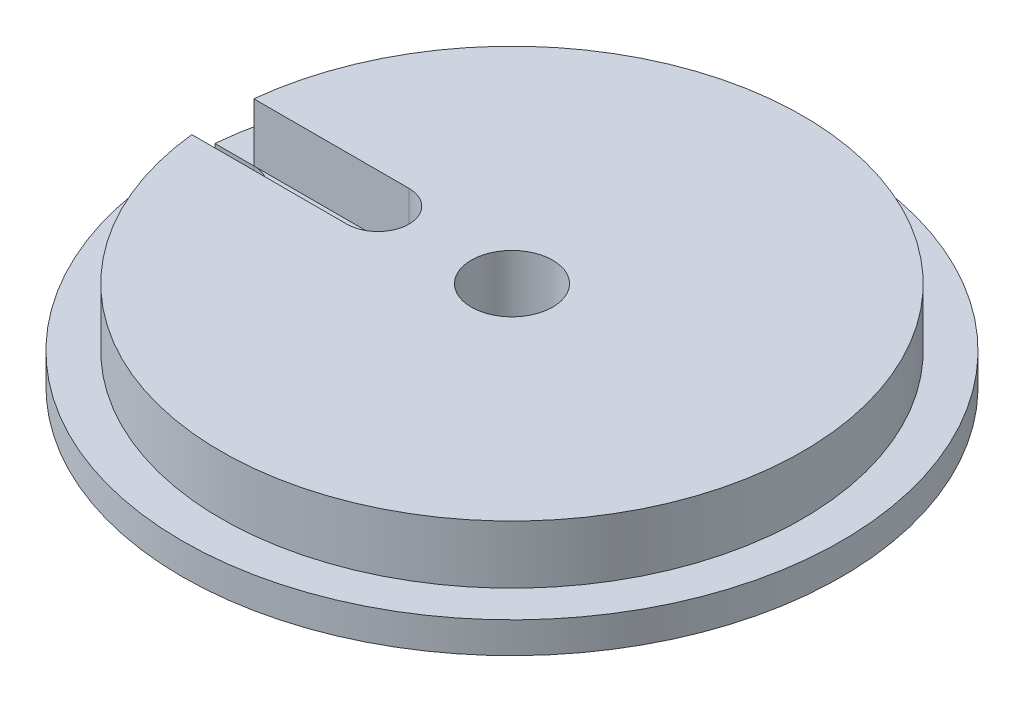
ISO-10303-21;
HEADER;
FILE_DESCRIPTION(('STEP AP214'),'2;1');
FILE_NAME('part.step','',(''),(''),'','','');
FILE_SCHEMA(('AUTOMOTIVE_DESIGN { 1 0 10303 214 1 1 1 1 }'));
ENDSEC;
DATA;
#1=APPLICATION_CONTEXT('core data for automotive mechanical design processes');
#2=APPLICATION_PROTOCOL_DEFINITION('international standard','automotive_design',2000,#1);
#3=PRODUCT_CONTEXT('',#1,'mechanical');
#4=PRODUCT('Part','Part','',(#3));
#5=PRODUCT_RELATED_PRODUCT_CATEGORY('part','',(#4));
#6=PRODUCT_DEFINITION_FORMATION('','',#4);
#7=PRODUCT_DEFINITION_CONTEXT('part definition',#1,'design');
#8=PRODUCT_DEFINITION('design','',#6,#7);
#9=PRODUCT_DEFINITION_SHAPE('','',#8);
#10=(LENGTH_UNIT() NAMED_UNIT(*) SI_UNIT(.MILLI.,.METRE.));
#11=(NAMED_UNIT(*) PLANE_ANGLE_UNIT() SI_UNIT($,.RADIAN.));
#12=(NAMED_UNIT(*) SI_UNIT($,.STERADIAN.) SOLID_ANGLE_UNIT());
#13=UNCERTAINTY_MEASURE_WITH_UNIT(LENGTH_MEASURE(1.E-05),#10,'distance_accuracy_value','');
#14=(GEOMETRIC_REPRESENTATION_CONTEXT(3) GLOBAL_UNCERTAINTY_ASSIGNED_CONTEXT((#13)) GLOBAL_UNIT_ASSIGNED_CONTEXT((#10,
#11,#12)) REPRESENTATION_CONTEXT('',''));
#15=CARTESIAN_POINT('',(0.,0.,0.));
#16=DIRECTION('',(0.,0.,1.));
#17=DIRECTION('',(1.,0.,0.));
#18=AXIS2_PLACEMENT_3D('',#15,#16,#17);
#19=CARTESIAN_POINT('',(0.,3.,0.));
#20=DIRECTION('',(0.,1.,0.));
#21=DIRECTION('',(0.,0.,1.));
#22=AXIS2_PLACEMENT_3D('',#19,#20,#21);
#23=PLANE('',#22);
#24=DIRECTION('',(-1.,0.,0.));
#25=VECTOR('',#24,1.);
#26=CARTESIAN_POINT('',(-14.9144225500017,3.,-1.6));
#27=LINE('',#26,#25);
#28=CARTESIAN_POINT('',(-6.91442255000173,3.,-1.6));
#29=VERTEX_POINT('',#28);
#30=CARTESIAN_POINT('',(-14.9144225500017,3.,-1.6));
#31=VERTEX_POINT('',#30);
#32=EDGE_CURVE('E130',#29,#31,#27,.T.);
#33=ORIENTED_EDGE('',*,*,#32,.F.);
#34=CARTESIAN_POINT('',(-6.91442255000173,3.,0.));
#35=DIRECTION('',(0.,1.,0.));
#36=DIRECTION('',(0.,0.,-1.));
#37=AXIS2_PLACEMENT_3D('',#34,#35,#36);
#38=CIRCLE('',#37,1.6);
#39=CARTESIAN_POINT('',(-6.91442255000173,3.,1.6));
#40=VERTEX_POINT('',#39);
#41=EDGE_CURVE('E122',#40,#29,#38,.T.);
#42=ORIENTED_EDGE('',*,*,#41,.F.);
#43=DIRECTION('',(1.,0.,0.));
#44=VECTOR('',#43,1.);
#45=CARTESIAN_POINT('',(-14.9144225500017,3.,1.6));
#46=LINE('',#45,#44);
#47=CARTESIAN_POINT('',(-14.9144225500017,3.,1.6));
#48=VERTEX_POINT('',#47);
#49=EDGE_CURVE('E119',#48,#40,#46,.T.);
#50=ORIENTED_EDGE('',*,*,#49,.F.);
#51=CARTESIAN_POINT('',(0.,3.,0.));
#52=DIRECTION('',(0.,1.,0.));
#53=DIRECTION('',(0.,0.,1.));
#54=AXIS2_PLACEMENT_3D('',#51,#52,#53);
#55=CIRCLE('',#54,15.);
#56=EDGE_CURVE('E144',#48,#31,#55,.T.);
#57=ORIENTED_EDGE('',*,*,#56,.T.);
#58=EDGE_LOOP('',(#33,#42,#50,#57));
#59=FACE_BOUND('',#58,.T.);
#60=CARTESIAN_POINT('',(0.,3.,0.));
#61=DIRECTION('',(0.,1.,0.));
#62=DIRECTION('',(0.,0.,1.));
#63=AXIS2_PLACEMENT_3D('',#60,#61,#62);
#64=CIRCLE('',#63,2.1);
#65=CARTESIAN_POINT('',(0.,3.,2.1));
#66=VERTEX_POINT('',#65);
#67=EDGE_CURVE('E140',#66,#66,#64,.T.);
#68=ORIENTED_EDGE('',*,*,#67,.F.);
#69=EDGE_LOOP('',(#68));
#70=FACE_BOUND('',#69,.T.);
#71=ADVANCED_FACE('F35',(#59,#70),#23,.T.);
#72=CARTESIAN_POINT('',(0.,3.,0.));
#73=DIRECTION('',(0.,-1.,0.));
#74=DIRECTION('',(0.,0.,-1.));
#75=AXIS2_PLACEMENT_3D('',#72,#73,#74);
#76=CYLINDRICAL_SURFACE('',#75,15.);
#77=CARTESIAN_POINT('',(0.,0.,0.));
#78=DIRECTION('',(0.,1.,0.));
#79=DIRECTION('',(0.,0.,1.));
#80=AXIS2_PLACEMENT_3D('',#77,#78,#79);
#81=CIRCLE('',#80,15.);
#82=CARTESIAN_POINT('',(-14.9144225500017,0.,1.6));
#83=VERTEX_POINT('',#82);
#84=CARTESIAN_POINT('',(-14.9144225500017,0.,-1.6));
#85=VERTEX_POINT('',#84);
#86=EDGE_CURVE('E143',#83,#85,#81,.T.);
#87=ORIENTED_EDGE('',*,*,#86,.T.);
#88=DIRECTION('',(0.,-1.,0.));
#89=VECTOR('',#88,1.);
#90=CARTESIAN_POINT('',(-14.9144225500017,3.,-1.6));
#91=LINE('',#90,#89);
#92=EDGE_CURVE('E11',#85,#31,#91,.F.);
#93=ORIENTED_EDGE('',*,*,#92,.T.);
#94=ORIENTED_EDGE('',*,*,#56,.F.);
#95=DIRECTION('',(0.,-1.,0.));
#96=VECTOR('',#95,1.);
#97=CARTESIAN_POINT('',(-14.9144225500017,3.,1.6));
#98=LINE('',#97,#96);
#99=EDGE_CURVE('E43',#48,#83,#98,.T.);
#100=ORIENTED_EDGE('',*,*,#99,.T.);
#101=EDGE_LOOP('',(#87,#93,#94,#100));
#102=FACE_BOUND('',#101,.T.);
#103=ADVANCED_FACE('F37',(#102),#76,.T.);
#104=CARTESIAN_POINT('',(0.,3.,0.));
#105=DIRECTION('',(0.,-1.,0.));
#106=DIRECTION('',(0.,0.,-1.));
#107=AXIS2_PLACEMENT_3D('',#104,#105,#106);
#108=CYLINDRICAL_SURFACE('',#107,2.1);
#109=ORIENTED_EDGE('',*,*,#67,.T.);
#110=EDGE_LOOP('',(#109));
#111=FACE_BOUND('',#110,.T.);
#112=CARTESIAN_POINT('',(0.,-1.6,0.));
#113=DIRECTION('',(0.,-1.,0.));
#114=DIRECTION('',(0.,0.,-1.));
#115=AXIS2_PLACEMENT_3D('',#112,#113,#114);
#116=CIRCLE('',#115,2.1);
#117=CARTESIAN_POINT('',(0.,-1.6,-2.1));
#118=VERTEX_POINT('',#117);
#119=EDGE_CURVE('E182',#118,#118,#116,.T.);
#120=ORIENTED_EDGE('',*,*,#119,.T.);
#121=EDGE_LOOP('',(#120));
#122=FACE_BOUND('',#121,.T.);
#123=ADVANCED_FACE('F188',(#111,#122),#108,.F.);
#124=CARTESIAN_POINT('',(-6.91442255000173,-7.,0.));
#125=DIRECTION('',(0.,1.,0.));
#126=DIRECTION('',(0.,0.,1.));
#127=AXIS2_PLACEMENT_3D('',#124,#125,#126);
#128=CYLINDRICAL_SURFACE('',#127,1.6);
#129=DIRECTION('',(0.,1.,0.));
#130=VECTOR('',#129,1.);
#131=CARTESIAN_POINT('',(-6.91442255000173,-7.,1.6));
#132=LINE('',#131,#130);
#133=CARTESIAN_POINT('',(-6.91442255000173,0.,1.6));
#134=VERTEX_POINT('',#133);
#135=EDGE_CURVE('E132',#134,#40,#132,.T.);
#136=ORIENTED_EDGE('',*,*,#135,.T.);
#137=ORIENTED_EDGE('',*,*,#41,.T.);
#138=DIRECTION('',(0.,1.,0.));
#139=VECTOR('',#138,1.);
#140=CARTESIAN_POINT('',(-6.91442255000173,-7.,-1.6));
#141=LINE('',#140,#139);
#142=CARTESIAN_POINT('',(-6.91442255000173,0.,-1.6));
#143=VERTEX_POINT('',#142);
#144=EDGE_CURVE('E133',#143,#29,#141,.T.);
#145=ORIENTED_EDGE('',*,*,#144,.F.);
#146=CARTESIAN_POINT('',(-6.91442255000173,0.,0.));
#147=DIRECTION('',(0.,-1.,0.));
#148=DIRECTION('',(0.,0.,-1.));
#149=AXIS2_PLACEMENT_3D('',#146,#147,#148);
#150=CIRCLE('',#149,1.6);
#151=EDGE_CURVE('E178',#134,#143,#150,.T.);
#152=ORIENTED_EDGE('',*,*,#151,.F.);
#153=EDGE_LOOP('',(#136,#137,#145,#152));
#154=FACE_BOUND('',#153,.T.);
#155=CARTESIAN_POINT('',(-6.91442255000173,-1.6,0.));
#156=DIRECTION('',(0.,-1.,0.));
#157=DIRECTION('',(0.,0.,-1.));
#158=AXIS2_PLACEMENT_3D('',#155,#156,#157);
#159=CIRCLE('',#158,1.6);
#160=CARTESIAN_POINT('',(-6.91442255000173,-1.6,-1.6));
#161=VERTEX_POINT('',#160);
#162=EDGE_CURVE('E176',#161,#161,#159,.T.);
#163=ORIENTED_EDGE('',*,*,#162,.T.);
#164=EDGE_LOOP('',(#163));
#165=FACE_BOUND('',#164,.T.);
#166=ADVANCED_FACE('F209',(#154,#165),#128,.F.);
#167=CARTESIAN_POINT('',(-14.9144225500017,-7.,-1.6));
#168=DIRECTION('',(0.,0.,-1.));
#169=DIRECTION('',(-1.,0.,0.));
#170=AXIS2_PLACEMENT_3D('',#167,#168,#169);
#171=PLANE('',#170);
#172=ORIENTED_EDGE('',*,*,#144,.T.);
#173=ORIENTED_EDGE('',*,*,#32,.T.);
#174=ORIENTED_EDGE('',*,*,#92,.F.);
#175=DIRECTION('',(-1.,0.,0.));
#176=VECTOR('',#175,1.);
#177=CARTESIAN_POINT('',(0.,0.,-1.6));
#178=LINE('',#177,#176);
#179=EDGE_CURVE('E137',#143,#85,#178,.T.);
#180=ORIENTED_EDGE('',*,*,#179,.F.);
#181=EDGE_LOOP('',(#172,#173,#174,#180));
#182=FACE_BOUND('',#181,.T.);
#183=ADVANCED_FACE('F213',(#182),#171,.F.);
#184=CARTESIAN_POINT('',(-14.9144225500017,-7.,1.6));
#185=DIRECTION('',(0.,0.,1.));
#186=DIRECTION('',(1.,0.,0.));
#187=AXIS2_PLACEMENT_3D('',#184,#185,#186);
#188=PLANE('',#187);
#189=ORIENTED_EDGE('',*,*,#99,.F.);
#190=ORIENTED_EDGE('',*,*,#49,.T.);
#191=ORIENTED_EDGE('',*,*,#135,.F.);
#192=DIRECTION('',(1.,0.,0.));
#193=VECTOR('',#192,1.);
#194=CARTESIAN_POINT('',(0.,0.,1.6));
#195=LINE('',#194,#193);
#196=EDGE_CURVE('E50',#83,#134,#195,.T.);
#197=ORIENTED_EDGE('',*,*,#196,.F.);
#198=EDGE_LOOP('',(#189,#190,#191,#197));
#199=FACE_BOUND('',#198,.T.);
#200=ADVANCED_FACE('F197',(#199),#188,.F.);
#201=CARTESIAN_POINT('',(0.,0.,0.));
#202=DIRECTION('',(0.,-1.,0.));
#203=DIRECTION('',(0.,0.,-1.));
#204=AXIS2_PLACEMENT_3D('',#201,#202,#203);
#205=PLANE('',#204);
#206=ORIENTED_EDGE('',*,*,#151,.T.);
#207=ORIENTED_EDGE('',*,*,#179,.T.);
#208=CARTESIAN_POINT('',(-14.9144225500017,0.,0.));
#209=DIRECTION('',(0.,1.,0.));
#210=DIRECTION('',(0.,0.,1.));
#211=AXIS2_PLACEMENT_3D('',#208,#209,#210);
#212=CIRCLE('',#211,1.6);
#213=EDGE_CURVE('E155',#83,#85,#212,.T.);
#214=ORIENTED_EDGE('',*,*,#213,.F.);
#215=ORIENTED_EDGE('',*,*,#196,.T.);
#216=EDGE_LOOP('',(#206,#207,#214,#215));
#217=FACE_BOUND('',#216,.T.);
#218=ADVANCED_FACE('F165',(#217),#205,.F.);
#219=CARTESIAN_POINT('',(0.,-1.6,0.));
#220=DIRECTION('',(0.,-1.,0.));
#221=DIRECTION('',(0.,0.,-1.));
#222=AXIS2_PLACEMENT_3D('',#219,#220,#221);
#223=PLANE('',#222);
#224=ORIENTED_EDGE('',*,*,#162,.F.);
#225=EDGE_LOOP('',(#224));
#226=FACE_BOUND('',#225,.T.);
#227=CARTESIAN_POINT('',(0.,-1.6,0.));
#228=DIRECTION('',(0.,-1.,0.));
#229=DIRECTION('',(0.,0.,-1.));
#230=AXIS2_PLACEMENT_3D('',#227,#228,#229);
#231=CIRCLE('',#230,17.);
#232=CARTESIAN_POINT('',(-16.924538398432,-1.6,-1.6));
#233=VERTEX_POINT('',#232);
#234=CARTESIAN_POINT('',(-16.924538398432,-1.6,1.6));
#235=VERTEX_POINT('',#234);
#236=EDGE_CURVE('E104',#233,#235,#231,.T.);
#237=ORIENTED_EDGE('',*,*,#236,.T.);
#238=DIRECTION('',(1.,0.,0.));
#239=VECTOR('',#238,1.);
#240=CARTESIAN_POINT('',(-14.9144225500017,-1.6,1.6));
#241=LINE('',#240,#239);
#242=CARTESIAN_POINT('',(-14.9144225500017,-1.6,1.6));
#243=VERTEX_POINT('',#242);
#244=EDGE_CURVE('E92',#235,#243,#241,.T.);
#245=ORIENTED_EDGE('',*,*,#244,.T.);
#246=CARTESIAN_POINT('',(-14.9144225500017,-1.6,0.));
#247=DIRECTION('',(0.,1.,0.));
#248=DIRECTION('',(0.,0.,1.));
#249=AXIS2_PLACEMENT_3D('',#246,#247,#248);
#250=CIRCLE('',#249,1.6);
#251=CARTESIAN_POINT('',(-14.9144225500017,-1.6,-1.6));
#252=VERTEX_POINT('',#251);
#253=EDGE_CURVE('E103',#243,#252,#250,.T.);
#254=ORIENTED_EDGE('',*,*,#253,.T.);
#255=DIRECTION('',(-1.,0.,0.));
#256=VECTOR('',#255,1.);
#257=CARTESIAN_POINT('',(-16.924538398432,-1.6,-1.6));
#258=LINE('',#257,#256);
#259=EDGE_CURVE('E110',#252,#233,#258,.T.);
#260=ORIENTED_EDGE('',*,*,#259,.T.);
#261=EDGE_LOOP('',(#237,#245,#254,#260));
#262=FACE_BOUND('',#261,.T.);
#263=ORIENTED_EDGE('',*,*,#119,.F.);
#264=EDGE_LOOP('',(#263));
#265=FACE_BOUND('',#264,.T.);
#266=ADVANCED_FACE('F107',(#226,#262,#265),#223,.T.);
#267=ORIENTED_EDGE('',*,*,#86,.F.);
#268=DIRECTION('',(1.,0.,0.));
#269=VECTOR('',#268,1.);
#270=CARTESIAN_POINT('',(-14.9144225500017,0.,1.6));
#271=LINE('',#270,#269);
#272=CARTESIAN_POINT('',(-16.924538398432,0.,1.6));
#273=VERTEX_POINT('',#272);
#274=EDGE_CURVE('E154',#273,#83,#271,.T.);
#275=ORIENTED_EDGE('',*,*,#274,.F.);
#276=CARTESIAN_POINT('',(0.,0.,0.));
#277=DIRECTION('',(0.,-1.,0.));
#278=DIRECTION('',(0.,0.,-1.));
#279=AXIS2_PLACEMENT_3D('',#276,#277,#278);
#280=CIRCLE('',#279,17.);
#281=CARTESIAN_POINT('',(-16.924538398432,0.,-1.6));
#282=VERTEX_POINT('',#281);
#283=EDGE_CURVE('E118',#282,#273,#280,.T.);
#284=ORIENTED_EDGE('',*,*,#283,.F.);
#285=DIRECTION('',(-1.,0.,0.));
#286=VECTOR('',#285,1.);
#287=CARTESIAN_POINT('',(-16.924538398432,0.,-1.6));
#288=LINE('',#287,#286);
#289=EDGE_CURVE('E114',#85,#282,#288,.T.);
#290=ORIENTED_EDGE('',*,*,#289,.F.);
#291=EDGE_LOOP('',(#267,#275,#284,#290));
#292=FACE_BOUND('',#291,.T.);
#293=ADVANCED_FACE('F153',(#292),#205,.F.);
#294=CARTESIAN_POINT('',(0.,-1.6,0.));
#295=DIRECTION('',(0.,1.,0.));
#296=DIRECTION('',(0.,0.,1.));
#297=AXIS2_PLACEMENT_3D('',#294,#295,#296);
#298=CYLINDRICAL_SURFACE('',#297,17.);
#299=ORIENTED_EDGE('',*,*,#283,.T.);
#300=DIRECTION('',(0.,1.,0.));
#301=VECTOR('',#300,1.);
#302=CARTESIAN_POINT('',(-16.924538398432,-1.6,1.6));
#303=LINE('',#302,#301);
#304=EDGE_CURVE('E97',#235,#273,#303,.T.);
#305=ORIENTED_EDGE('',*,*,#304,.F.);
#306=ORIENTED_EDGE('',*,*,#236,.F.);
#307=DIRECTION('',(0.,1.,0.));
#308=VECTOR('',#307,1.);
#309=CARTESIAN_POINT('',(-16.924538398432,-1.6,-1.6));
#310=LINE('',#309,#308);
#311=EDGE_CURVE('E171',#233,#282,#310,.T.);
#312=ORIENTED_EDGE('',*,*,#311,.T.);
#313=EDGE_LOOP('',(#299,#305,#306,#312));
#314=FACE_BOUND('',#313,.T.);
#315=ADVANCED_FACE('F116',(#314),#298,.T.);
#316=CARTESIAN_POINT('',(-14.9144225500017,-1.6,1.6));
#317=DIRECTION('',(0.,0.,1.));
#318=DIRECTION('',(1.,0.,0.));
#319=AXIS2_PLACEMENT_3D('',#316,#317,#318);
#320=PLANE('',#319);
#321=ORIENTED_EDGE('',*,*,#274,.T.);
#322=DIRECTION('',(0.,1.,0.));
#323=VECTOR('',#322,1.);
#324=CARTESIAN_POINT('',(-14.9144225500017,-1.6,1.6));
#325=LINE('',#324,#323);
#326=EDGE_CURVE('E100',#243,#83,#325,.T.);
#327=ORIENTED_EDGE('',*,*,#326,.F.);
#328=ORIENTED_EDGE('',*,*,#244,.F.);
#329=ORIENTED_EDGE('',*,*,#304,.T.);
#330=EDGE_LOOP('',(#321,#327,#328,#329));
#331=FACE_BOUND('',#330,.T.);
#332=ADVANCED_FACE('F95',(#331),#320,.F.);
#333=CARTESIAN_POINT('',(-14.9144225500017,-1.6,0.));
#334=DIRECTION('',(0.,1.,0.));
#335=DIRECTION('',(0.,0.,1.));
#336=AXIS2_PLACEMENT_3D('',#333,#334,#335);
#337=CYLINDRICAL_SURFACE('',#336,1.6);
#338=ORIENTED_EDGE('',*,*,#213,.T.);
#339=DIRECTION('',(0.,1.,0.));
#340=VECTOR('',#339,1.);
#341=CARTESIAN_POINT('',(-14.9144225500017,-1.6,-1.6));
#342=LINE('',#341,#340);
#343=EDGE_CURVE('E124',#252,#85,#342,.T.);
#344=ORIENTED_EDGE('',*,*,#343,.F.);
#345=ORIENTED_EDGE('',*,*,#253,.F.);
#346=ORIENTED_EDGE('',*,*,#326,.T.);
#347=EDGE_LOOP('',(#338,#344,#345,#346));
#348=FACE_BOUND('',#347,.T.);
#349=ADVANCED_FACE('F160',(#348),#337,.F.);
#350=CARTESIAN_POINT('',(-16.924538398432,-1.6,-1.6));
#351=DIRECTION('',(0.,0.,-1.));
#352=DIRECTION('',(-1.,0.,0.));
#353=AXIS2_PLACEMENT_3D('',#350,#351,#352);
#354=PLANE('',#353);
#355=ORIENTED_EDGE('',*,*,#289,.T.);
#356=ORIENTED_EDGE('',*,*,#311,.F.);
#357=ORIENTED_EDGE('',*,*,#259,.F.);
#358=ORIENTED_EDGE('',*,*,#343,.T.);
#359=EDGE_LOOP('',(#355,#356,#357,#358));
#360=FACE_BOUND('',#359,.T.);
#361=ADVANCED_FACE('F173',(#360),#354,.F.);
#362=CLOSED_SHELL('',(#71,#103,#123,#166,#183,#200,#218,#266,#293,#315,#332,#349,#361));
#363=MANIFOLD_SOLID_BREP('B2',#362);
#364=ADVANCED_BREP_SHAPE_REPRESENTATION('',(#18,#363),#14);
#365=SHAPE_DEFINITION_REPRESENTATION(#9,#364);
ENDSEC;
END-ISO-10303-21;
